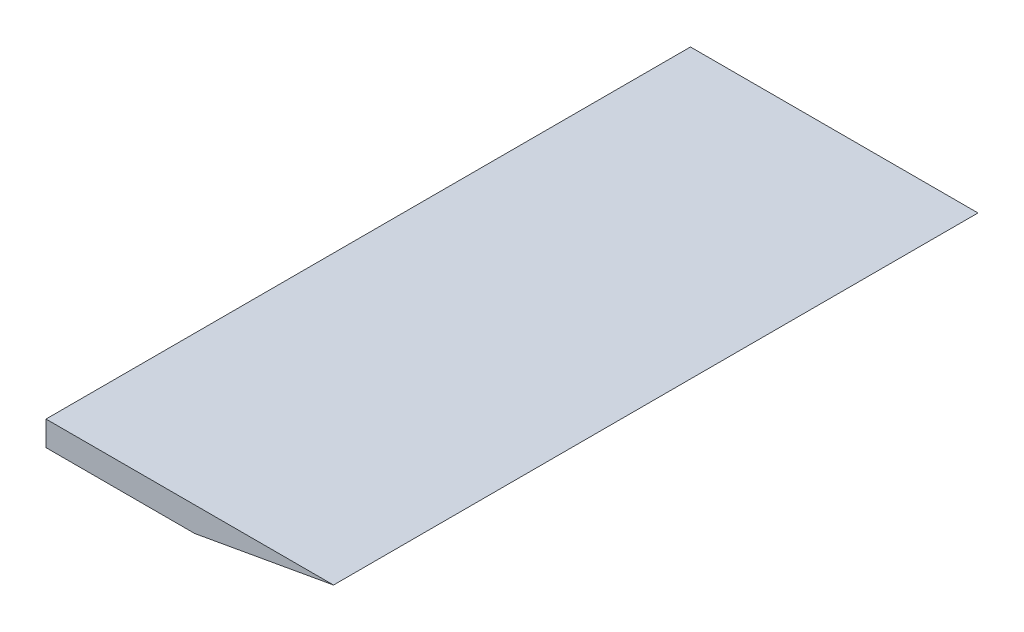
ISO-10303-21;
HEADER;
FILE_DESCRIPTION(('STEP AP214'),'2;1');
FILE_NAME('part.step','',(''),(''),'','','');
FILE_SCHEMA(('AUTOMOTIVE_DESIGN { 1 0 10303 214 1 1 1 1 }'));
ENDSEC;
DATA;
#1=APPLICATION_CONTEXT('core data for automotive mechanical design processes');
#2=APPLICATION_PROTOCOL_DEFINITION('international standard','automotive_design',2000,#1);
#3=PRODUCT_CONTEXT('',#1,'mechanical');
#4=PRODUCT('Part','Part','',(#3));
#5=PRODUCT_RELATED_PRODUCT_CATEGORY('part','',(#4));
#6=PRODUCT_DEFINITION_FORMATION('','',#4);
#7=PRODUCT_DEFINITION_CONTEXT('part definition',#1,'design');
#8=PRODUCT_DEFINITION('design','',#6,#7);
#9=PRODUCT_DEFINITION_SHAPE('','',#8);
#10=(LENGTH_UNIT() NAMED_UNIT(*) SI_UNIT(.MILLI.,.METRE.));
#11=(NAMED_UNIT(*) PLANE_ANGLE_UNIT() SI_UNIT($,.RADIAN.));
#12=(NAMED_UNIT(*) SI_UNIT($,.STERADIAN.) SOLID_ANGLE_UNIT());
#13=UNCERTAINTY_MEASURE_WITH_UNIT(LENGTH_MEASURE(1.E-05),#10,'distance_accuracy_value','');
#14=(GEOMETRIC_REPRESENTATION_CONTEXT(3) GLOBAL_UNCERTAINTY_ASSIGNED_CONTEXT((#13)) GLOBAL_UNIT_ASSIGNED_CONTEXT((#10,
#11,#12)) REPRESENTATION_CONTEXT('',''));
#15=CARTESIAN_POINT('',(0.,0.,0.));
#16=DIRECTION('',(0.,0.,1.));
#17=DIRECTION('',(1.,0.,0.));
#18=AXIS2_PLACEMENT_3D('',#15,#16,#17);
#19=CARTESIAN_POINT('',(0.,-5.,130.));
#20=DIRECTION('',(1.,0.,0.));
#21=DIRECTION('',(0.,0.,-1.));
#22=AXIS2_PLACEMENT_3D('',#19,#20,#21);
#23=PLANE('',#22);
#24=DIRECTION('',(0.,-1.,0.));
#25=VECTOR('',#24,1.);
#26=CARTESIAN_POINT('',(0.,-5.,0.));
#27=LINE('',#26,#25);
#28=CARTESIAN_POINT('',(0.,0.,0.));
#29=VERTEX_POINT('',#28);
#30=CARTESIAN_POINT('',(0.,-5.,0.));
#31=VERTEX_POINT('',#30);
#32=EDGE_CURVE('E107',#29,#31,#27,.T.);
#33=ORIENTED_EDGE('',*,*,#32,.T.);
#34=DIRECTION('',(0.,0.,-1.));
#35=VECTOR('',#34,1.);
#36=CARTESIAN_POINT('',(0.,-5.,130.));
#37=LINE('',#36,#35);
#38=CARTESIAN_POINT('',(0.,-5.,130.));
#39=VERTEX_POINT('',#38);
#40=EDGE_CURVE('E11',#39,#31,#37,.T.);
#41=ORIENTED_EDGE('',*,*,#40,.F.);
#42=DIRECTION('',(0.,-1.,0.));
#43=VECTOR('',#42,1.);
#44=CARTESIAN_POINT('',(0.,-5.,130.));
#45=LINE('',#44,#43);
#46=CARTESIAN_POINT('',(0.,0.,130.));
#47=VERTEX_POINT('',#46);
#48=EDGE_CURVE('E91',#47,#39,#45,.T.);
#49=ORIENTED_EDGE('',*,*,#48,.F.);
#50=DIRECTION('',(0.,0.,-1.));
#51=VECTOR('',#50,1.);
#52=CARTESIAN_POINT('',(0.,0.,130.));
#53=LINE('',#52,#51);
#54=EDGE_CURVE('E103',#47,#29,#53,.T.);
#55=ORIENTED_EDGE('',*,*,#54,.T.);
#56=EDGE_LOOP('',(#33,#41,#49,#55));
#57=FACE_BOUND('',#56,.T.);
#58=ADVANCED_FACE('F39',(#57),#23,.F.);
#59=CARTESIAN_POINT('',(30.,-5.,130.));
#60=DIRECTION('',(0.,1.,0.));
#61=DIRECTION('',(-1.,0.,0.));
#62=AXIS2_PLACEMENT_3D('',#59,#60,#61);
#63=PLANE('',#62);
#64=DIRECTION('',(1.,0.,0.));
#65=VECTOR('',#64,1.);
#66=CARTESIAN_POINT('',(30.,-5.,0.));
#67=LINE('',#66,#65);
#68=CARTESIAN_POINT('',(30.,-5.,0.));
#69=VERTEX_POINT('',#68);
#70=EDGE_CURVE('E96',#31,#69,#67,.T.);
#71=ORIENTED_EDGE('',*,*,#70,.T.);
#72=DIRECTION('',(0.,0.,-1.));
#73=VECTOR('',#72,1.);
#74=CARTESIAN_POINT('',(30.,-5.,130.));
#75=LINE('',#74,#73);
#76=CARTESIAN_POINT('',(30.,-5.,130.));
#77=VERTEX_POINT('',#76);
#78=EDGE_CURVE('E48',#77,#69,#75,.T.);
#79=ORIENTED_EDGE('',*,*,#78,.F.);
#80=DIRECTION('',(1.,0.,0.));
#81=VECTOR('',#80,1.);
#82=CARTESIAN_POINT('',(30.,-5.,130.));
#83=LINE('',#82,#81);
#84=EDGE_CURVE('E86',#39,#77,#83,.T.);
#85=ORIENTED_EDGE('',*,*,#84,.F.);
#86=ORIENTED_EDGE('',*,*,#40,.T.);
#87=EDGE_LOOP('',(#71,#79,#85,#86));
#88=FACE_BOUND('',#87,.T.);
#89=ADVANCED_FACE('F95',(#88),#63,.F.);
#90=CARTESIAN_POINT('',(58.,0.,130.));
#91=DIRECTION('',(-0.175790638483658,0.984427575508482,0.));
#92=DIRECTION('',(-0.984427575508482,-0.175790638483658,0.));
#93=AXIS2_PLACEMENT_3D('',#90,#91,#92);
#94=PLANE('',#93);
#95=DIRECTION('',(0.984427575508482,0.175790638483658,0.));
#96=VECTOR('',#95,1.);
#97=CARTESIAN_POINT('',(58.,0.,0.));
#98=LINE('',#97,#96);
#99=CARTESIAN_POINT('',(58.,0.,0.));
#100=VERTEX_POINT('',#99);
#101=EDGE_CURVE('E73',#69,#100,#98,.T.);
#102=ORIENTED_EDGE('',*,*,#101,.T.);
#103=DIRECTION('',(0.,0.,-1.));
#104=VECTOR('',#103,1.);
#105=CARTESIAN_POINT('',(58.,0.,130.));
#106=LINE('',#105,#104);
#107=CARTESIAN_POINT('',(58.,0.,130.));
#108=VERTEX_POINT('',#107);
#109=EDGE_CURVE('E98',#108,#100,#106,.T.);
#110=ORIENTED_EDGE('',*,*,#109,.F.);
#111=DIRECTION('',(0.984427575508482,0.175790638483658,0.));
#112=VECTOR('',#111,1.);
#113=CARTESIAN_POINT('',(58.,0.,130.));
#114=LINE('',#113,#112);
#115=EDGE_CURVE('E89',#77,#108,#114,.T.);
#116=ORIENTED_EDGE('',*,*,#115,.F.);
#117=ORIENTED_EDGE('',*,*,#78,.T.);
#118=EDGE_LOOP('',(#102,#110,#116,#117));
#119=FACE_BOUND('',#118,.T.);
#120=ADVANCED_FACE('F99',(#119),#94,.F.);
#121=CARTESIAN_POINT('',(0.,0.,130.));
#122=DIRECTION('',(0.,-1.,0.));
#123=DIRECTION('',(0.,0.,-1.));
#124=AXIS2_PLACEMENT_3D('',#121,#122,#123);
#125=PLANE('',#124);
#126=DIRECTION('',(-1.,0.,0.));
#127=VECTOR('',#126,1.);
#128=CARTESIAN_POINT('',(0.,0.,0.));
#129=LINE('',#128,#127);
#130=EDGE_CURVE('E79',#100,#29,#129,.T.);
#131=ORIENTED_EDGE('',*,*,#130,.T.);
#132=ORIENTED_EDGE('',*,*,#54,.F.);
#133=DIRECTION('',(-1.,0.,0.));
#134=VECTOR('',#133,1.);
#135=CARTESIAN_POINT('',(0.,0.,130.));
#136=LINE('',#135,#134);
#137=EDGE_CURVE('E56',#108,#47,#136,.T.);
#138=ORIENTED_EDGE('',*,*,#137,.F.);
#139=ORIENTED_EDGE('',*,*,#109,.T.);
#140=EDGE_LOOP('',(#131,#132,#138,#139));
#141=FACE_BOUND('',#140,.T.);
#142=ADVANCED_FACE('F120',(#141),#125,.F.);
#143=CARTESIAN_POINT('',(0.,0.,130.));
#144=DIRECTION('',(0.,0.,-1.));
#145=DIRECTION('',(-1.,0.,0.));
#146=AXIS2_PLACEMENT_3D('',#143,#144,#145);
#147=PLANE('',#146);
#148=ORIENTED_EDGE('',*,*,#48,.T.);
#149=ORIENTED_EDGE('',*,*,#84,.T.);
#150=ORIENTED_EDGE('',*,*,#115,.T.);
#151=ORIENTED_EDGE('',*,*,#137,.T.);
#152=EDGE_LOOP('',(#148,#149,#150,#151));
#153=FACE_BOUND('',#152,.T.);
#154=ADVANCED_FACE('F87',(#153),#147,.F.);
#155=CARTESIAN_POINT('',(0.,0.,0.));
#156=DIRECTION('',(0.,0.,-1.));
#157=DIRECTION('',(-1.,0.,0.));
#158=AXIS2_PLACEMENT_3D('',#155,#156,#157);
#159=PLANE('',#158);
#160=ORIENTED_EDGE('',*,*,#32,.F.);
#161=ORIENTED_EDGE('',*,*,#130,.F.);
#162=ORIENTED_EDGE('',*,*,#101,.F.);
#163=ORIENTED_EDGE('',*,*,#70,.F.);
#164=EDGE_LOOP('',(#160,#161,#162,#163));
#165=FACE_BOUND('',#164,.T.);
#166=ADVANCED_FACE('F123',(#165),#159,.T.);
#167=CLOSED_SHELL('',(#58,#89,#120,#142,#154,#166));
#168=MANIFOLD_SOLID_BREP('B2',#167);
#169=ADVANCED_BREP_SHAPE_REPRESENTATION('',(#18,#168),#14);
#170=SHAPE_DEFINITION_REPRESENTATION(#9,#169);
ENDSEC;
END-ISO-10303-21;
